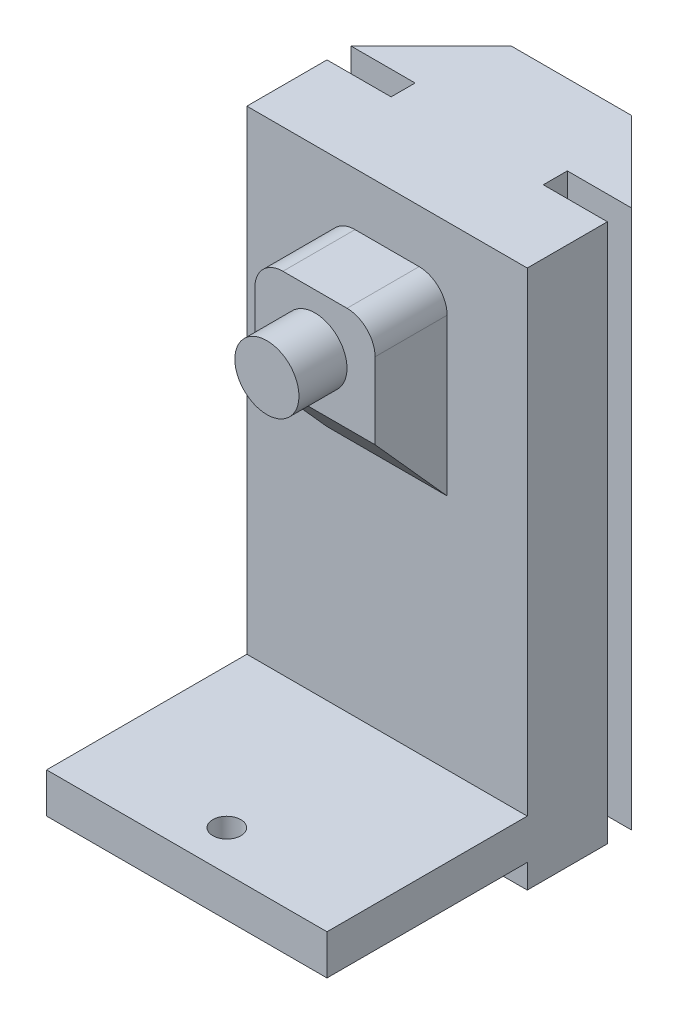
ISO-10303-21;
HEADER;
FILE_DESCRIPTION(('STEP AP214'),'2;1');
FILE_NAME('part.step','',(''),(''),'','','');
FILE_SCHEMA(('AUTOMOTIVE_DESIGN { 1 0 10303 214 1 1 1 1 }'));
ENDSEC;
DATA;
#1=APPLICATION_CONTEXT('core data for automotive mechanical design processes');
#2=APPLICATION_PROTOCOL_DEFINITION('international standard','automotive_design',2000,#1);
#3=PRODUCT_CONTEXT('',#1,'mechanical');
#4=PRODUCT('Part','Part','',(#3));
#5=PRODUCT_RELATED_PRODUCT_CATEGORY('part','',(#4));
#6=PRODUCT_DEFINITION_FORMATION('','',#4);
#7=PRODUCT_DEFINITION_CONTEXT('part definition',#1,'design');
#8=PRODUCT_DEFINITION('design','',#6,#7);
#9=PRODUCT_DEFINITION_SHAPE('','',#8);
#10=(LENGTH_UNIT() NAMED_UNIT(*) SI_UNIT(.MILLI.,.METRE.));
#11=(NAMED_UNIT(*) PLANE_ANGLE_UNIT() SI_UNIT($,.RADIAN.));
#12=(NAMED_UNIT(*) SI_UNIT($,.STERADIAN.) SOLID_ANGLE_UNIT());
#13=UNCERTAINTY_MEASURE_WITH_UNIT(LENGTH_MEASURE(1.E-05),#10,'distance_accuracy_value','');
#14=(GEOMETRIC_REPRESENTATION_CONTEXT(3) GLOBAL_UNCERTAINTY_ASSIGNED_CONTEXT((#13)) GLOBAL_UNIT_ASSIGNED_CONTEXT((#10,
#11,#12)) REPRESENTATION_CONTEXT('',''));
#15=CARTESIAN_POINT('',(0.,0.,0.));
#16=DIRECTION('',(0.,0.,1.));
#17=DIRECTION('',(1.,0.,0.));
#18=AXIS2_PLACEMENT_3D('',#15,#16,#17);
#19=CARTESIAN_POINT('',(-17.5,67.25,27.1211370506567));
#20=DIRECTION('',(0.,0.,-1.));
#21=DIRECTION('',(-1.,0.,0.));
#22=AXIS2_PLACEMENT_3D('',#19,#20,#21);
#23=PLANE('',#22);
#24=DIRECTION('',(0.,1.,0.));
#25=VECTOR('',#24,1.);
#26=CARTESIAN_POINT('',(7.5,47.65,27.1211370506567));
#27=LINE('',#26,#25);
#28=CARTESIAN_POINT('',(7.5,37.6100229741097,27.1211370506567));
#29=VERTEX_POINT('',#28);
#30=CARTESIAN_POINT('',(7.5,57.15,27.1211370506567));
#31=VERTEX_POINT('',#30);
#32=EDGE_CURVE('E267',#29,#31,#27,.T.);
#33=ORIENTED_EDGE('',*,*,#32,.F.);
#34=DIRECTION('',(-1.,0.,0.));
#35=VECTOR('',#34,1.);
#36=CARTESIAN_POINT('',(7.5,37.6100229741097,27.1211370506567));
#37=LINE('',#36,#35);
#38=CARTESIAN_POINT('',(-7.5,37.6100229741097,27.1211370506567));
#39=VERTEX_POINT('',#38);
#40=EDGE_CURVE('E236',#29,#39,#37,.T.);
#41=ORIENTED_EDGE('',*,*,#40,.T.);
#42=DIRECTION('',(0.,-1.,0.));
#43=VECTOR('',#42,1.);
#44=CARTESIAN_POINT('',(-7.5,47.65,27.1211370506567));
#45=LINE('',#44,#43);
#46=CARTESIAN_POINT('',(-7.5,57.15,27.1211370506567));
#47=VERTEX_POINT('',#46);
#48=EDGE_CURVE('E241',#47,#39,#45,.T.);
#49=ORIENTED_EDGE('',*,*,#48,.F.);
#50=CARTESIAN_POINT('',(-4.,57.15,27.1211370506567));
#51=DIRECTION('',(0.,0.,1.));
#52=DIRECTION('',(-1.,0.,0.));
#53=AXIS2_PLACEMENT_3D('',#50,#51,#52);
#54=CIRCLE('',#53,3.5);
#55=CARTESIAN_POINT('',(-4.,60.65,27.1211370506567));
#56=VERTEX_POINT('',#55);
#57=EDGE_CURVE('E250',#56,#47,#54,.T.);
#58=ORIENTED_EDGE('',*,*,#57,.F.);
#59=DIRECTION('',(-1.,0.,0.));
#60=VECTOR('',#59,1.);
#61=CARTESIAN_POINT('',(-4.,60.65,27.1211370506567));
#62=LINE('',#61,#60);
#63=CARTESIAN_POINT('',(4.,60.65,27.1211370506567));
#64=VERTEX_POINT('',#63);
#65=EDGE_CURVE('E272',#64,#56,#62,.T.);
#66=ORIENTED_EDGE('',*,*,#65,.F.);
#67=CARTESIAN_POINT('',(4.,57.15,27.1211370506567));
#68=DIRECTION('',(0.,0.,1.));
#69=DIRECTION('',(-1.,0.,0.));
#70=AXIS2_PLACEMENT_3D('',#67,#68,#69);
#71=CIRCLE('',#70,3.5);
#72=EDGE_CURVE('E68',#31,#64,#71,.T.);
#73=ORIENTED_EDGE('',*,*,#72,.F.);
#74=EDGE_LOOP('',(#33,#41,#49,#58,#66,#73));
#75=FACE_BOUND('',#74,.T.);
#76=DIRECTION('',(-1.,0.,0.));
#77=VECTOR('',#76,1.);
#78=CARTESIAN_POINT('',(17.5,8.,27.1211370506567));
#79=LINE('',#78,#77);
#80=CARTESIAN_POINT('',(17.5,8.,27.1211370506567));
#81=VERTEX_POINT('',#80);
#82=CARTESIAN_POINT('',(-17.5,8.,27.1211370506567));
#83=VERTEX_POINT('',#82);
#84=EDGE_CURVE('E486',#81,#83,#79,.T.);
#85=ORIENTED_EDGE('',*,*,#84,.F.);
#86=DIRECTION('',(0.,-1.,0.));
#87=VECTOR('',#86,1.);
#88=CARTESIAN_POINT('',(17.5,67.25,27.1211370506567));
#89=LINE('',#88,#87);
#90=CARTESIAN_POINT('',(17.5,67.25,27.1211370506567));
#91=VERTEX_POINT('',#90);
#92=EDGE_CURVE('E213',#91,#81,#89,.T.);
#93=ORIENTED_EDGE('',*,*,#92,.F.);
#94=DIRECTION('',(1.,0.,0.));
#95=VECTOR('',#94,1.);
#96=CARTESIAN_POINT('',(-17.5,67.25,27.1211370506567));
#97=LINE('',#96,#95);
#98=CARTESIAN_POINT('',(-17.5,67.25,27.1211370506567));
#99=VERTEX_POINT('',#98);
#100=EDGE_CURVE('E315',#99,#91,#97,.T.);
#101=ORIENTED_EDGE('',*,*,#100,.F.);
#102=DIRECTION('',(0.,-1.,0.));
#103=VECTOR('',#102,1.);
#104=CARTESIAN_POINT('',(-17.5,67.25,27.1211370506567));
#105=LINE('',#104,#103);
#106=EDGE_CURVE('E403',#99,#83,#105,.T.);
#107=ORIENTED_EDGE('',*,*,#106,.T.);
#108=EDGE_LOOP('',(#85,#93,#101,#107));
#109=FACE_BOUND('',#108,.T.);
#110=ADVANCED_FACE('F44',(#75,#109),#23,.F.);
#111=DIRECTION('',(-1.,0.,0.));
#112=VECTOR('',#111,1.);
#113=CARTESIAN_POINT('',(17.5,3.,27.1211370506567));
#114=LINE('',#113,#112);
#115=CARTESIAN_POINT('',(17.5,3.,27.1211370506567));
#116=VERTEX_POINT('',#115);
#117=CARTESIAN_POINT('',(-17.5,3.,27.1211370506567));
#118=VERTEX_POINT('',#117);
#119=EDGE_CURVE('E65',#116,#118,#114,.T.);
#120=ORIENTED_EDGE('',*,*,#119,.T.);
#121=CARTESIAN_POINT('',(-17.5,0.,27.1211370506567));
#122=VERTEX_POINT('',#121);
#123=EDGE_CURVE('E404',#118,#122,#105,.T.);
#124=ORIENTED_EDGE('',*,*,#123,.T.);
#125=DIRECTION('',(1.,0.,0.));
#126=VECTOR('',#125,1.);
#127=CARTESIAN_POINT('',(-17.5,0.,27.1211370506567));
#128=LINE('',#127,#126);
#129=CARTESIAN_POINT('',(17.5,0.,27.1211370506567));
#130=VERTEX_POINT('',#129);
#131=EDGE_CURVE('E348',#122,#130,#128,.T.);
#132=ORIENTED_EDGE('',*,*,#131,.T.);
#133=EDGE_CURVE('E402',#116,#130,#89,.T.);
#134=ORIENTED_EDGE('',*,*,#133,.F.);
#135=EDGE_LOOP('',(#120,#124,#132,#134));
#136=FACE_BOUND('',#135,.T.);
#137=ADVANCED_FACE('F479',(#136),#23,.F.);
#138=CARTESIAN_POINT('',(-17.5,67.25,14.1211370506567));
#139=DIRECTION('',(0.,0.,-1.));
#140=DIRECTION('',(-1.,0.,0.));
#141=AXIS2_PLACEMENT_3D('',#138,#139,#140);
#142=PLANE('',#141);
#143=DIRECTION('',(1.,0.,0.));
#144=VECTOR('',#143,1.);
#145=CARTESIAN_POINT('',(-17.5,0.,14.1211370506567));
#146=LINE('',#145,#144);
#147=CARTESIAN_POINT('',(-17.5,0.,14.1211370506567));
#148=VERTEX_POINT('',#147);
#149=CARTESIAN_POINT('',(-9.5,0.,14.1211370506567));
#150=VERTEX_POINT('',#149);
#151=EDGE_CURVE('E300',#148,#150,#146,.T.);
#152=ORIENTED_EDGE('',*,*,#151,.T.);
#153=DIRECTION('',(0.,-1.,0.));
#154=VECTOR('',#153,1.);
#155=CARTESIAN_POINT('',(-9.5,67.25,14.1211370506567));
#156=LINE('',#155,#154);
#157=CARTESIAN_POINT('',(-9.5,67.25,14.1211370506567));
#158=VERTEX_POINT('',#157);
#159=EDGE_CURVE('E54',#158,#150,#156,.T.);
#160=ORIENTED_EDGE('',*,*,#159,.F.);
#161=DIRECTION('',(1.,0.,0.));
#162=VECTOR('',#161,1.);
#163=CARTESIAN_POINT('',(-17.5,67.25,14.1211370506567));
#164=LINE('',#163,#162);
#165=CARTESIAN_POINT('',(-17.5,67.25,14.1211370506567));
#166=VERTEX_POINT('',#165);
#167=EDGE_CURVE('E296',#166,#158,#164,.T.);
#168=ORIENTED_EDGE('',*,*,#167,.F.);
#169=DIRECTION('',(0.,-1.,0.));
#170=VECTOR('',#169,1.);
#171=CARTESIAN_POINT('',(-17.5,67.25,14.1211370506567));
#172=LINE('',#171,#170);
#173=EDGE_CURVE('E337',#166,#148,#172,.T.);
#174=ORIENTED_EDGE('',*,*,#173,.T.);
#175=EDGE_LOOP('',(#152,#160,#168,#174));
#176=FACE_BOUND('',#175,.T.);
#177=ADVANCED_FACE('F50',(#176),#142,.F.);
#178=CARTESIAN_POINT('',(-9.5,67.25,17.1211370506567));
#179=DIRECTION('',(1.,0.,0.));
#180=DIRECTION('',(0.,0.,-1.));
#181=AXIS2_PLACEMENT_3D('',#178,#179,#180);
#182=PLANE('',#181);
#183=DIRECTION('',(0.,0.,1.));
#184=VECTOR('',#183,1.);
#185=CARTESIAN_POINT('',(-9.5,0.,17.1211370506567));
#186=LINE('',#185,#184);
#187=CARTESIAN_POINT('',(-9.5,0.,17.1211370506567));
#188=VERTEX_POINT('',#187);
#189=EDGE_CURVE('E338',#150,#188,#186,.T.);
#190=ORIENTED_EDGE('',*,*,#189,.T.);
#191=DIRECTION('',(0.,-1.,0.));
#192=VECTOR('',#191,1.);
#193=CARTESIAN_POINT('',(-9.5,67.25,17.1211370506567));
#194=LINE('',#193,#192);
#195=CARTESIAN_POINT('',(-9.5,67.25,17.1211370506567));
#196=VERTEX_POINT('',#195);
#197=EDGE_CURVE('E414',#196,#188,#194,.T.);
#198=ORIENTED_EDGE('',*,*,#197,.F.);
#199=DIRECTION('',(0.,0.,1.));
#200=VECTOR('',#199,1.);
#201=CARTESIAN_POINT('',(-9.5,67.25,17.1211370506567));
#202=LINE('',#201,#200);
#203=EDGE_CURVE('E305',#158,#196,#202,.T.);
#204=ORIENTED_EDGE('',*,*,#203,.F.);
#205=ORIENTED_EDGE('',*,*,#159,.T.);
#206=EDGE_LOOP('',(#190,#198,#204,#205));
#207=FACE_BOUND('',#206,.T.);
#208=ADVANCED_FACE('F423',(#207),#182,.F.);
#209=CARTESIAN_POINT('',(-17.5,67.25,17.1211370506567));
#210=DIRECTION('',(0.,0.,1.));
#211=DIRECTION('',(1.,0.,0.));
#212=AXIS2_PLACEMENT_3D('',#209,#210,#211);
#213=PLANE('',#212);
#214=DIRECTION('',(-1.,0.,0.));
#215=VECTOR('',#214,1.);
#216=CARTESIAN_POINT('',(-17.5,0.,17.1211370506567));
#217=LINE('',#216,#215);
#218=CARTESIAN_POINT('',(-17.5,0.,17.1211370506567));
#219=VERTEX_POINT('',#218);
#220=EDGE_CURVE('E342',#188,#219,#217,.T.);
#221=ORIENTED_EDGE('',*,*,#220,.T.);
#222=DIRECTION('',(0.,-1.,0.));
#223=VECTOR('',#222,1.);
#224=CARTESIAN_POINT('',(-17.5,67.25,17.1211370506567));
#225=LINE('',#224,#223);
#226=CARTESIAN_POINT('',(-17.5,67.25,17.1211370506567));
#227=VERTEX_POINT('',#226);
#228=EDGE_CURVE('E408',#227,#219,#225,.T.);
#229=ORIENTED_EDGE('',*,*,#228,.F.);
#230=DIRECTION('',(-1.,0.,0.));
#231=VECTOR('',#230,1.);
#232=CARTESIAN_POINT('',(-17.5,67.25,17.1211370506567));
#233=LINE('',#232,#231);
#234=EDGE_CURVE('E306',#196,#227,#233,.T.);
#235=ORIENTED_EDGE('',*,*,#234,.F.);
#236=ORIENTED_EDGE('',*,*,#197,.T.);
#237=EDGE_LOOP('',(#221,#229,#235,#236));
#238=FACE_BOUND('',#237,.T.);
#239=ADVANCED_FACE('F436',(#238),#213,.F.);
#240=CARTESIAN_POINT('',(-17.5,67.25,27.1211370506567));
#241=DIRECTION('',(1.,0.,0.));
#242=DIRECTION('',(0.,0.,-1.));
#243=AXIS2_PLACEMENT_3D('',#240,#241,#242);
#244=PLANE('',#243);
#245=DIRECTION('',(0.,0.,1.));
#246=VECTOR('',#245,1.);
#247=CARTESIAN_POINT('',(-17.5,0.,27.1211370506567));
#248=LINE('',#247,#246);
#249=EDGE_CURVE('E347',#219,#122,#248,.T.);
#250=ORIENTED_EDGE('',*,*,#249,.T.);
#251=ORIENTED_EDGE('',*,*,#123,.F.);
#252=DIRECTION('',(0.,0.,-1.));
#253=VECTOR('',#252,1.);
#254=CARTESIAN_POINT('',(-17.5,3.,27.1211370506567));
#255=LINE('',#254,#253);
#256=CARTESIAN_POINT('',(-17.5,3.,52.1211370506567));
#257=VERTEX_POINT('',#256);
#258=EDGE_CURVE('E219',#257,#118,#255,.T.);
#259=ORIENTED_EDGE('',*,*,#258,.F.);
#260=DIRECTION('',(0.,-1.,0.));
#261=VECTOR('',#260,1.);
#262=CARTESIAN_POINT('',(-17.5,3.,52.1211370506567));
#263=LINE('',#262,#261);
#264=CARTESIAN_POINT('',(-17.5,8.,52.1211370506567));
#265=VERTEX_POINT('',#264);
#266=EDGE_CURVE('E482',#265,#257,#263,.T.);
#267=ORIENTED_EDGE('',*,*,#266,.F.);
#268=DIRECTION('',(0.,0.,1.));
#269=VECTOR('',#268,1.);
#270=CARTESIAN_POINT('',(-17.5,8.,52.1211370506567));
#271=LINE('',#270,#269);
#272=EDGE_CURVE('E225',#83,#265,#271,.T.);
#273=ORIENTED_EDGE('',*,*,#272,.F.);
#274=ORIENTED_EDGE('',*,*,#106,.F.);
#275=DIRECTION('',(0.,0.,1.));
#276=VECTOR('',#275,1.);
#277=CARTESIAN_POINT('',(-17.5,67.25,27.1211370506567));
#278=LINE('',#277,#276);
#279=EDGE_CURVE('E307',#227,#99,#278,.T.);
#280=ORIENTED_EDGE('',*,*,#279,.F.);
#281=ORIENTED_EDGE('',*,*,#228,.T.);
#282=EDGE_LOOP('',(#250,#251,#259,#267,#273,#274,#280,#281));
#283=FACE_BOUND('',#282,.T.);
#284=ADVANCED_FACE('F439',(#283),#244,.F.);
#285=CARTESIAN_POINT('',(17.5,67.25,27.1211370506567));
#286=DIRECTION('',(-1.,0.,0.));
#287=DIRECTION('',(0.,0.,1.));
#288=AXIS2_PLACEMENT_3D('',#285,#286,#287);
#289=PLANE('',#288);
#290=DIRECTION('',(0.,0.,-1.));
#291=VECTOR('',#290,1.);
#292=CARTESIAN_POINT('',(17.5,0.,27.1211370506567));
#293=LINE('',#292,#291);
#294=CARTESIAN_POINT('',(17.5,0.,17.1211370506567));
#295=VERTEX_POINT('',#294);
#296=EDGE_CURVE('E351',#130,#295,#293,.T.);
#297=ORIENTED_EDGE('',*,*,#296,.T.);
#298=DIRECTION('',(0.,-1.,0.));
#299=VECTOR('',#298,1.);
#300=CARTESIAN_POINT('',(17.5,67.25,17.1211370506567));
#301=LINE('',#300,#299);
#302=CARTESIAN_POINT('',(17.5,67.25,17.1211370506567));
#303=VERTEX_POINT('',#302);
#304=EDGE_CURVE('E400',#303,#295,#301,.T.);
#305=ORIENTED_EDGE('',*,*,#304,.F.);
#306=DIRECTION('',(0.,0.,-1.));
#307=VECTOR('',#306,1.);
#308=CARTESIAN_POINT('',(17.5,67.25,27.1211370506567));
#309=LINE('',#308,#307);
#310=EDGE_CURVE('E314',#91,#303,#309,.T.);
#311=ORIENTED_EDGE('',*,*,#310,.F.);
#312=ORIENTED_EDGE('',*,*,#92,.T.);
#313=DIRECTION('',(0.,0.,1.));
#314=VECTOR('',#313,1.);
#315=CARTESIAN_POINT('',(17.5,8.,52.1211370506567));
#316=LINE('',#315,#314);
#317=CARTESIAN_POINT('',(17.5,8.,52.1211370506567));
#318=VERTEX_POINT('',#317);
#319=EDGE_CURVE('E206',#81,#318,#316,.T.);
#320=ORIENTED_EDGE('',*,*,#319,.T.);
#321=DIRECTION('',(0.,-1.,0.));
#322=VECTOR('',#321,1.);
#323=CARTESIAN_POINT('',(17.5,3.,52.1211370506567));
#324=LINE('',#323,#322);
#325=CARTESIAN_POINT('',(17.5,3.,52.1211370506567));
#326=VERTEX_POINT('',#325);
#327=EDGE_CURVE('E200',#318,#326,#324,.T.);
#328=ORIENTED_EDGE('',*,*,#327,.T.);
#329=DIRECTION('',(0.,0.,-1.));
#330=VECTOR('',#329,1.);
#331=CARTESIAN_POINT('',(17.5,3.,27.1211370506567));
#332=LINE('',#331,#330);
#333=EDGE_CURVE('E210',#326,#116,#332,.T.);
#334=ORIENTED_EDGE('',*,*,#333,.T.);
#335=ORIENTED_EDGE('',*,*,#133,.T.);
#336=EDGE_LOOP('',(#297,#305,#311,#312,#320,#328,#334,#335));
#337=FACE_BOUND('',#336,.T.);
#338=ADVANCED_FACE('F211',(#337),#289,.F.);
#339=CARTESIAN_POINT('',(17.5,67.25,17.1211370506567));
#340=DIRECTION('',(0.,0.,1.));
#341=DIRECTION('',(1.,0.,0.));
#342=AXIS2_PLACEMENT_3D('',#339,#340,#341);
#343=PLANE('',#342);
#344=DIRECTION('',(-1.,0.,0.));
#345=VECTOR('',#344,1.);
#346=CARTESIAN_POINT('',(17.5,0.,17.1211370506567));
#347=LINE('',#346,#345);
#348=CARTESIAN_POINT('',(9.5,0.,17.1211370506567));
#349=VERTEX_POINT('',#348);
#350=EDGE_CURVE('E357',#295,#349,#347,.T.);
#351=ORIENTED_EDGE('',*,*,#350,.T.);
#352=DIRECTION('',(0.,-1.,0.));
#353=VECTOR('',#352,1.);
#354=CARTESIAN_POINT('',(9.5,67.25,17.1211370506567));
#355=LINE('',#354,#353);
#356=CARTESIAN_POINT('',(9.5,67.25,17.1211370506567));
#357=VERTEX_POINT('',#356);
#358=EDGE_CURVE('E394',#357,#349,#355,.T.);
#359=ORIENTED_EDGE('',*,*,#358,.F.);
#360=DIRECTION('',(-1.,0.,0.));
#361=VECTOR('',#360,1.);
#362=CARTESIAN_POINT('',(17.5,67.25,17.1211370506567));
#363=LINE('',#362,#361);
#364=EDGE_CURVE('E319',#303,#357,#363,.T.);
#365=ORIENTED_EDGE('',*,*,#364,.F.);
#366=ORIENTED_EDGE('',*,*,#304,.T.);
#367=EDGE_LOOP('',(#351,#359,#365,#366));
#368=FACE_BOUND('',#367,.T.);
#369=ADVANCED_FACE('F475',(#368),#343,.F.);
#370=CARTESIAN_POINT('',(9.5,67.25,17.1211370506567));
#371=DIRECTION('',(-1.,0.,0.));
#372=DIRECTION('',(0.,0.,1.));
#373=AXIS2_PLACEMENT_3D('',#370,#371,#372);
#374=PLANE('',#373);
#375=DIRECTION('',(0.,0.,-1.));
#376=VECTOR('',#375,1.);
#377=CARTESIAN_POINT('',(9.5,0.,17.1211370506567));
#378=LINE('',#377,#376);
#379=CARTESIAN_POINT('',(9.5,0.,14.1211370506567));
#380=VERTEX_POINT('',#379);
#381=EDGE_CURVE('E359',#349,#380,#378,.T.);
#382=ORIENTED_EDGE('',*,*,#381,.T.);
#383=DIRECTION('',(0.,-1.,0.));
#384=VECTOR('',#383,1.);
#385=CARTESIAN_POINT('',(9.5,67.25,14.1211370506567));
#386=LINE('',#385,#384);
#387=CARTESIAN_POINT('',(9.5,67.25,14.1211370506567));
#388=VERTEX_POINT('',#387);
#389=EDGE_CURVE('E388',#388,#380,#386,.T.);
#390=ORIENTED_EDGE('',*,*,#389,.F.);
#391=DIRECTION('',(0.,0.,-1.));
#392=VECTOR('',#391,1.);
#393=CARTESIAN_POINT('',(9.5,67.25,17.1211370506567));
#394=LINE('',#393,#392);
#395=EDGE_CURVE('E321',#357,#388,#394,.T.);
#396=ORIENTED_EDGE('',*,*,#395,.F.);
#397=ORIENTED_EDGE('',*,*,#358,.T.);
#398=EDGE_LOOP('',(#382,#390,#396,#397));
#399=FACE_BOUND('',#398,.T.);
#400=ADVANCED_FACE('F470',(#399),#374,.F.);
#401=CARTESIAN_POINT('',(17.5,67.25,14.1211370506567));
#402=DIRECTION('',(0.,0.,-1.));
#403=DIRECTION('',(-1.,0.,0.));
#404=AXIS2_PLACEMENT_3D('',#401,#402,#403);
#405=PLANE('',#404);
#406=DIRECTION('',(1.,0.,0.));
#407=VECTOR('',#406,1.);
#408=CARTESIAN_POINT('',(17.5,0.,14.1211370506567));
#409=LINE('',#408,#407);
#410=CARTESIAN_POINT('',(17.5,0.,14.1211370506567));
#411=VERTEX_POINT('',#410);
#412=EDGE_CURVE('E361',#380,#411,#409,.T.);
#413=ORIENTED_EDGE('',*,*,#412,.T.);
#414=DIRECTION('',(0.,-1.,0.));
#415=VECTOR('',#414,1.);
#416=CARTESIAN_POINT('',(17.5,67.25,14.1211370506567));
#417=LINE('',#416,#415);
#418=CARTESIAN_POINT('',(17.5,67.25,14.1211370506567));
#419=VERTEX_POINT('',#418);
#420=EDGE_CURVE('E383',#419,#411,#417,.T.);
#421=ORIENTED_EDGE('',*,*,#420,.F.);
#422=DIRECTION('',(1.,0.,0.));
#423=VECTOR('',#422,1.);
#424=CARTESIAN_POINT('',(17.5,67.25,14.1211370506567));
#425=LINE('',#424,#423);
#426=EDGE_CURVE('E323',#388,#419,#425,.T.);
#427=ORIENTED_EDGE('',*,*,#426,.F.);
#428=ORIENTED_EDGE('',*,*,#389,.T.);
#429=EDGE_LOOP('',(#413,#421,#427,#428));
#430=FACE_BOUND('',#429,.T.);
#431=ADVANCED_FACE('F464',(#430),#405,.F.);
#432=CARTESIAN_POINT('',(17.5,67.25,14.1211370506567));
#433=DIRECTION('',(-0.707106781186549,0.,0.707106781186546));
#434=DIRECTION('',(0.707106781186546,0.,0.707106781186549));
#435=AXIS2_PLACEMENT_3D('',#432,#433,#434);
#436=PLANE('',#435);
#437=DIRECTION('',(-0.707106781186546,0.,-0.707106781186549));
#438=VECTOR('',#437,1.);
#439=CARTESIAN_POINT('',(17.5,0.,14.1211370506567));
#440=LINE('',#439,#438);
#441=CARTESIAN_POINT('',(7.50000000000004,0.,4.12113705065668));
#442=VERTEX_POINT('',#441);
#443=EDGE_CURVE('E366',#411,#442,#440,.T.);
#444=ORIENTED_EDGE('',*,*,#443,.T.);
#445=DIRECTION('',(0.,-1.,0.));
#446=VECTOR('',#445,1.);
#447=CARTESIAN_POINT('',(7.50000000000004,67.25,4.12113705065668));
#448=LINE('',#447,#446);
#449=CARTESIAN_POINT('',(7.50000000000004,67.25,4.12113705065668));
#450=VERTEX_POINT('',#449);
#451=EDGE_CURVE('E382',#450,#442,#448,.T.);
#452=ORIENTED_EDGE('',*,*,#451,.F.);
#453=DIRECTION('',(-0.707106781186546,0.,-0.707106781186549));
#454=VECTOR('',#453,1.);
#455=CARTESIAN_POINT('',(17.5,67.25,14.1211370506567));
#456=LINE('',#455,#454);
#457=EDGE_CURVE('E330',#419,#450,#456,.T.);
#458=ORIENTED_EDGE('',*,*,#457,.F.);
#459=ORIENTED_EDGE('',*,*,#420,.T.);
#460=EDGE_LOOP('',(#444,#452,#458,#459));
#461=FACE_BOUND('',#460,.T.);
#462=ADVANCED_FACE('F459',(#461),#436,.F.);
#463=CARTESIAN_POINT('',(-7.50000000000004,67.25,4.12113705065667));
#464=DIRECTION('',(0.,0.,1.));
#465=DIRECTION('',(1.,0.,0.));
#466=AXIS2_PLACEMENT_3D('',#463,#464,#465);
#467=PLANE('',#466);
#468=DIRECTION('',(-1.,0.,0.));
#469=VECTOR('',#468,1.);
#470=CARTESIAN_POINT('',(-7.50000000000004,0.,4.12113705065667));
#471=LINE('',#470,#469);
#472=CARTESIAN_POINT('',(-7.50000000000004,0.,4.12113705065667));
#473=VERTEX_POINT('',#472);
#474=EDGE_CURVE('E367',#442,#473,#471,.T.);
#475=ORIENTED_EDGE('',*,*,#474,.T.);
#476=DIRECTION('',(0.,-1.,0.));
#477=VECTOR('',#476,1.);
#478=CARTESIAN_POINT('',(-7.50000000000004,67.25,4.12113705065667));
#479=LINE('',#478,#477);
#480=CARTESIAN_POINT('',(-7.50000000000004,67.25,4.12113705065667));
#481=VERTEX_POINT('',#480);
#482=EDGE_CURVE('E380',#481,#473,#479,.T.);
#483=ORIENTED_EDGE('',*,*,#482,.F.);
#484=DIRECTION('',(-1.,0.,0.));
#485=VECTOR('',#484,1.);
#486=CARTESIAN_POINT('',(-7.50000000000004,67.25,4.12113705065667));
#487=LINE('',#486,#485);
#488=EDGE_CURVE('E328',#450,#481,#487,.T.);
#489=ORIENTED_EDGE('',*,*,#488,.F.);
#490=ORIENTED_EDGE('',*,*,#451,.T.);
#491=EDGE_LOOP('',(#475,#483,#489,#490));
#492=FACE_BOUND('',#491,.T.);
#493=ADVANCED_FACE('F455',(#492),#467,.F.);
#494=CARTESIAN_POINT('',(-17.5,67.25,14.1211370506567));
#495=DIRECTION('',(0.707106781186549,0.,0.707106781186546));
#496=DIRECTION('',(0.707106781186546,0.,-0.707106781186549));
#497=AXIS2_PLACEMENT_3D('',#494,#495,#496);
#498=PLANE('',#497);
#499=DIRECTION('',(-0.707106781186546,0.,0.707106781186549));
#500=VECTOR('',#499,1.);
#501=CARTESIAN_POINT('',(-17.5,0.,14.1211370506567));
#502=LINE('',#501,#500);
#503=EDGE_CURVE('E303',#473,#148,#502,.T.);
#504=ORIENTED_EDGE('',*,*,#503,.T.);
#505=ORIENTED_EDGE('',*,*,#173,.F.);
#506=DIRECTION('',(-0.707106781186546,0.,0.707106781186549));
#507=VECTOR('',#506,1.);
#508=CARTESIAN_POINT('',(-17.5,67.25,14.1211370506567));
#509=LINE('',#508,#507);
#510=EDGE_CURVE('E334',#481,#166,#509,.T.);
#511=ORIENTED_EDGE('',*,*,#510,.F.);
#512=ORIENTED_EDGE('',*,*,#482,.T.);
#513=EDGE_LOOP('',(#504,#505,#511,#512));
#514=FACE_BOUND('',#513,.T.);
#515=ADVANCED_FACE('F448',(#514),#498,.F.);
#516=CARTESIAN_POINT('',(0.,67.25,0.));
#517=DIRECTION('',(0.,1.,0.));
#518=DIRECTION('',(0.,0.,1.));
#519=AXIS2_PLACEMENT_3D('',#516,#517,#518);
#520=PLANE('',#519);
#521=ORIENTED_EDGE('',*,*,#167,.T.);
#522=ORIENTED_EDGE('',*,*,#203,.T.);
#523=ORIENTED_EDGE('',*,*,#234,.T.);
#524=ORIENTED_EDGE('',*,*,#279,.T.);
#525=ORIENTED_EDGE('',*,*,#100,.T.);
#526=ORIENTED_EDGE('',*,*,#310,.T.);
#527=ORIENTED_EDGE('',*,*,#364,.T.);
#528=ORIENTED_EDGE('',*,*,#395,.T.);
#529=ORIENTED_EDGE('',*,*,#426,.T.);
#530=ORIENTED_EDGE('',*,*,#457,.T.);
#531=ORIENTED_EDGE('',*,*,#488,.T.);
#532=ORIENTED_EDGE('',*,*,#510,.T.);
#533=EDGE_LOOP('',(#521,#522,#523,#524,#525,#526,#527,#528,#529,#530,#531,#532));
#534=FACE_BOUND('',#533,.T.);
#535=ADVANCED_FACE('F444',(#534),#520,.T.);
#536=CARTESIAN_POINT('',(0.,0.,0.));
#537=DIRECTION('',(0.,1.,0.));
#538=DIRECTION('',(0.,0.,1.));
#539=AXIS2_PLACEMENT_3D('',#536,#537,#538);
#540=PLANE('',#539);
#541=ORIENTED_EDGE('',*,*,#151,.F.);
#542=ORIENTED_EDGE('',*,*,#503,.F.);
#543=ORIENTED_EDGE('',*,*,#474,.F.);
#544=ORIENTED_EDGE('',*,*,#443,.F.);
#545=ORIENTED_EDGE('',*,*,#412,.F.);
#546=ORIENTED_EDGE('',*,*,#381,.F.);
#547=ORIENTED_EDGE('',*,*,#350,.F.);
#548=ORIENTED_EDGE('',*,*,#296,.F.);
#549=ORIENTED_EDGE('',*,*,#131,.F.);
#550=ORIENTED_EDGE('',*,*,#249,.F.);
#551=ORIENTED_EDGE('',*,*,#220,.F.);
#552=ORIENTED_EDGE('',*,*,#189,.F.);
#553=EDGE_LOOP('',(#541,#542,#543,#544,#545,#546,#547,#548,#549,#550,#551,#552));
#554=FACE_BOUND('',#553,.T.);
#555=ADVANCED_FACE('F429',(#554),#540,.F.);
#556=CARTESIAN_POINT('',(-4.,57.15,36.1211370506567));
#557=DIRECTION('',(0.,0.,-1.));
#558=DIRECTION('',(-1.,0.,0.));
#559=AXIS2_PLACEMENT_3D('',#556,#557,#558);
#560=PLANE('',#559);
#561=DIRECTION('',(0.,-1.,0.));
#562=VECTOR('',#561,1.);
#563=CARTESIAN_POINT('',(-7.5,47.65,36.1211370506567));
#564=LINE('',#563,#562);
#565=CARTESIAN_POINT('',(-7.5,57.15,36.1211370506567));
#566=VERTEX_POINT('',#565);
#567=CARTESIAN_POINT('',(-7.5,47.65,36.1211370506567));
#568=VERTEX_POINT('',#567);
#569=EDGE_CURVE('E245',#566,#568,#564,.T.);
#570=ORIENTED_EDGE('',*,*,#569,.T.);
#571=DIRECTION('',(1.,0.,0.));
#572=VECTOR('',#571,1.);
#573=CARTESIAN_POINT('',(-7.5,47.65,36.1211370506567));
#574=LINE('',#573,#572);
#575=CARTESIAN_POINT('',(7.5,47.65,36.1211370506567));
#576=VERTEX_POINT('',#575);
#577=EDGE_CURVE('E246',#568,#576,#574,.T.);
#578=ORIENTED_EDGE('',*,*,#577,.T.);
#579=DIRECTION('',(0.,1.,0.));
#580=VECTOR('',#579,1.);
#581=CARTESIAN_POINT('',(7.5,47.65,36.1211370506567));
#582=LINE('',#581,#580);
#583=CARTESIAN_POINT('',(7.5,57.15,36.1211370506567));
#584=VERTEX_POINT('',#583);
#585=EDGE_CURVE('E252',#576,#584,#582,.T.);
#586=ORIENTED_EDGE('',*,*,#585,.T.);
#587=CARTESIAN_POINT('',(4.,57.15,36.1211370506567));
#588=DIRECTION('',(0.,0.,1.));
#589=DIRECTION('',(-1.,0.,0.));
#590=AXIS2_PLACEMENT_3D('',#587,#588,#589);
#591=CIRCLE('',#590,3.5);
#592=CARTESIAN_POINT('',(4.,60.65,36.1211370506567));
#593=VERTEX_POINT('',#592);
#594=EDGE_CURVE('E251',#584,#593,#591,.T.);
#595=ORIENTED_EDGE('',*,*,#594,.T.);
#596=DIRECTION('',(-1.,0.,0.));
#597=VECTOR('',#596,1.);
#598=CARTESIAN_POINT('',(-4.,60.65,36.1211370506567));
#599=LINE('',#598,#597);
#600=CARTESIAN_POINT('',(-4.,60.65,36.1211370506567));
#601=VERTEX_POINT('',#600);
#602=EDGE_CURVE('E260',#593,#601,#599,.T.);
#603=ORIENTED_EDGE('',*,*,#602,.T.);
#604=CARTESIAN_POINT('',(-4.,57.15,36.1211370506567));
#605=DIRECTION('',(0.,0.,1.));
#606=DIRECTION('',(-1.,0.,0.));
#607=AXIS2_PLACEMENT_3D('',#604,#605,#606);
#608=CIRCLE('',#607,3.5);
#609=EDGE_CURVE('E259',#601,#566,#608,.T.);
#610=ORIENTED_EDGE('',*,*,#609,.T.);
#611=EDGE_LOOP('',(#570,#578,#586,#595,#603,#610));
#612=FACE_BOUND('',#611,.T.);
#613=CARTESIAN_POINT('',(0.,54.15,36.1211370506567));
#614=DIRECTION('',(0.,0.,-1.));
#615=DIRECTION('',(-1.,0.,0.));
#616=AXIS2_PLACEMENT_3D('',#613,#614,#615);
#617=CIRCLE('',#616,4.);
#618=CARTESIAN_POINT('',(-4.,54.15,36.1211370506567));
#619=VERTEX_POINT('',#618);
#620=EDGE_CURVE('E11',#619,#619,#617,.T.);
#621=ORIENTED_EDGE('',*,*,#620,.T.);
#622=EDGE_LOOP('',(#621));
#623=FACE_BOUND('',#622,.T.);
#624=ADVANCED_FACE('F626',(#612,#623),#560,.F.);
#625=CARTESIAN_POINT('',(-7.5,47.65,36.1211370506567));
#626=DIRECTION('',(1.,0.,0.));
#627=DIRECTION('',(0.,1.,0.));
#628=AXIS2_PLACEMENT_3D('',#625,#626,#627);
#629=PLANE('',#628);
#630=ORIENTED_EDGE('',*,*,#48,.T.);
#631=DIRECTION('',(0.,-0.744619524412858,-0.667489148872976));
#632=VECTOR('',#631,1.);
#633=CARTESIAN_POINT('',(-7.5,47.65,36.1211370506567));
#634=LINE('',#633,#632);
#635=EDGE_CURVE('E221',#568,#39,#634,.T.);
#636=ORIENTED_EDGE('',*,*,#635,.F.);
#637=ORIENTED_EDGE('',*,*,#569,.F.);
#638=DIRECTION('',(0.,0.,-1.));
#639=VECTOR('',#638,1.);
#640=CARTESIAN_POINT('',(-7.5,57.15,36.1211370506567));
#641=LINE('',#640,#639);
#642=EDGE_CURVE('E264',#566,#47,#641,.T.);
#643=ORIENTED_EDGE('',*,*,#642,.T.);
#644=EDGE_LOOP('',(#630,#636,#637,#643));
#645=FACE_BOUND('',#644,.T.);
#646=ADVANCED_FACE('F670',(#645),#629,.F.);
#647=CARTESIAN_POINT('',(7.5,47.65,36.1211370506567));
#648=DIRECTION('',(-1.,0.,0.));
#649=DIRECTION('',(0.,-1.,0.));
#650=AXIS2_PLACEMENT_3D('',#647,#648,#649);
#651=PLANE('',#650);
#652=ORIENTED_EDGE('',*,*,#32,.T.);
#653=DIRECTION('',(0.,0.,-1.));
#654=VECTOR('',#653,1.);
#655=CARTESIAN_POINT('',(7.5,57.15,36.1211370506567));
#656=LINE('',#655,#654);
#657=EDGE_CURVE('E286',#584,#31,#656,.T.);
#658=ORIENTED_EDGE('',*,*,#657,.F.);
#659=ORIENTED_EDGE('',*,*,#585,.F.);
#660=DIRECTION('',(0.,-0.744619524412858,-0.667489148872976));
#661=VECTOR('',#660,1.);
#662=CARTESIAN_POINT('',(7.5,47.65,36.1211370506567));
#663=LINE('',#662,#661);
#664=EDGE_CURVE('E230',#576,#29,#663,.T.);
#665=ORIENTED_EDGE('',*,*,#664,.T.);
#666=EDGE_LOOP('',(#652,#658,#659,#665));
#667=FACE_BOUND('',#666,.T.);
#668=ADVANCED_FACE('F658',(#667),#651,.F.);
#669=CARTESIAN_POINT('',(4.,57.15,36.1211370506567));
#670=DIRECTION('',(0.,0.,-1.));
#671=DIRECTION('',(-1.,0.,0.));
#672=AXIS2_PLACEMENT_3D('',#669,#670,#671);
#673=CYLINDRICAL_SURFACE('',#672,3.5);
#674=ORIENTED_EDGE('',*,*,#72,.T.);
#675=DIRECTION('',(0.,0.,-1.));
#676=VECTOR('',#675,1.);
#677=CARTESIAN_POINT('',(4.,60.65,36.1211370506567));
#678=LINE('',#677,#676);
#679=EDGE_CURVE('E283',#593,#64,#678,.T.);
#680=ORIENTED_EDGE('',*,*,#679,.F.);
#681=ORIENTED_EDGE('',*,*,#594,.F.);
#682=ORIENTED_EDGE('',*,*,#657,.T.);
#683=EDGE_LOOP('',(#674,#680,#681,#682));
#684=FACE_BOUND('',#683,.T.);
#685=ADVANCED_FACE('F666',(#684),#673,.T.);
#686=CARTESIAN_POINT('',(-4.,60.65,36.1211370506567));
#687=DIRECTION('',(0.,-1.,0.));
#688=DIRECTION('',(0.,0.,-1.));
#689=AXIS2_PLACEMENT_3D('',#686,#687,#688);
#690=PLANE('',#689);
#691=ORIENTED_EDGE('',*,*,#65,.T.);
#692=DIRECTION('',(0.,0.,-1.));
#693=VECTOR('',#692,1.);
#694=CARTESIAN_POINT('',(-4.,60.65,36.1211370506567));
#695=LINE('',#694,#693);
#696=EDGE_CURVE('E282',#601,#56,#695,.T.);
#697=ORIENTED_EDGE('',*,*,#696,.F.);
#698=ORIENTED_EDGE('',*,*,#602,.F.);
#699=ORIENTED_EDGE('',*,*,#679,.T.);
#700=EDGE_LOOP('',(#691,#697,#698,#699));
#701=FACE_BOUND('',#700,.T.);
#702=ADVANCED_FACE('F698',(#701),#690,.F.);
#703=CARTESIAN_POINT('',(-4.,57.15,36.1211370506567));
#704=DIRECTION('',(0.,0.,-1.));
#705=DIRECTION('',(-1.,0.,0.));
#706=AXIS2_PLACEMENT_3D('',#703,#704,#705);
#707=CYLINDRICAL_SURFACE('',#706,3.5);
#708=ORIENTED_EDGE('',*,*,#57,.T.);
#709=ORIENTED_EDGE('',*,*,#642,.F.);
#710=ORIENTED_EDGE('',*,*,#609,.F.);
#711=ORIENTED_EDGE('',*,*,#696,.T.);
#712=EDGE_LOOP('',(#708,#709,#710,#711));
#713=FACE_BOUND('',#712,.T.);
#714=ADVANCED_FACE('F640',(#713),#707,.T.);
#715=CARTESIAN_POINT('',(0.,54.15,42.1211370506567));
#716=DIRECTION('',(0.,0.,1.));
#717=DIRECTION('',(1.,0.,0.));
#718=AXIS2_PLACEMENT_3D('',#715,#716,#717);
#719=PLANE('',#718);
#720=CARTESIAN_POINT('',(0.,54.15,42.1211370506567));
#721=DIRECTION('',(0.,0.,1.));
#722=DIRECTION('',(1.,0.,0.));
#723=AXIS2_PLACEMENT_3D('',#720,#721,#722);
#724=CIRCLE('',#723,4.);
#725=CARTESIAN_POINT('',(4.,54.15,42.1211370506567));
#726=VERTEX_POINT('',#725);
#727=EDGE_CURVE('E291',#726,#726,#724,.T.);
#728=ORIENTED_EDGE('',*,*,#727,.T.);
#729=EDGE_LOOP('',(#728));
#730=FACE_BOUND('',#729,.T.);
#731=ADVANCED_FACE('F635',(#730),#719,.T.);
#732=CARTESIAN_POINT('',(0.,54.15,42.1211370506567));
#733=DIRECTION('',(0.,0.,-1.));
#734=DIRECTION('',(-1.,0.,0.));
#735=AXIS2_PLACEMENT_3D('',#732,#733,#734);
#736=CYLINDRICAL_SURFACE('',#735,4.);
#737=ORIENTED_EDGE('',*,*,#727,.F.);
#738=EDGE_LOOP('',(#737));
#739=FACE_BOUND('',#738,.T.);
#740=ORIENTED_EDGE('',*,*,#620,.F.);
#741=EDGE_LOOP('',(#740));
#742=FACE_BOUND('',#741,.T.);
#743=ADVANCED_FACE('F636',(#739,#742),#736,.T.);
#744=CARTESIAN_POINT('',(7.5,47.65,36.1211370506567));
#745=DIRECTION('',(0.,0.667489148872976,-0.744619524412857));
#746=DIRECTION('',(0.,0.744619524412858,0.667489148872976));
#747=AXIS2_PLACEMENT_3D('',#744,#745,#746);
#748=PLANE('',#747);
#749=ORIENTED_EDGE('',*,*,#635,.T.);
#750=ORIENTED_EDGE('',*,*,#40,.F.);
#751=ORIENTED_EDGE('',*,*,#664,.F.);
#752=ORIENTED_EDGE('',*,*,#577,.F.);
#753=EDGE_LOOP('',(#749,#750,#751,#752));
#754=FACE_BOUND('',#753,.T.);
#755=ADVANCED_FACE('F647',(#754),#748,.F.);
#756=CARTESIAN_POINT('',(17.5,8.,52.1211370506567));
#757=DIRECTION('',(0.,-1.,0.));
#758=DIRECTION('',(0.,0.,-1.));
#759=AXIS2_PLACEMENT_3D('',#756,#757,#758);
#760=PLANE('',#759);
#761=CARTESIAN_POINT('',(0.,8.,47.1211370506567));
#762=DIRECTION('',(0.,-1.,0.));
#763=DIRECTION('',(0.,0.,-1.));
#764=AXIS2_PLACEMENT_3D('',#761,#762,#763);
#765=CIRCLE('',#764,1.75);
#766=CARTESIAN_POINT('',(0.,8.,48.8711370506567));
#767=VERTEX_POINT('',#766);
#768=EDGE_CURVE('E494',#767,#767,#765,.T.);
#769=ORIENTED_EDGE('',*,*,#768,.T.);
#770=EDGE_LOOP('',(#769));
#771=FACE_BOUND('',#770,.T.);
#772=ORIENTED_EDGE('',*,*,#272,.T.);
#773=DIRECTION('',(-1.,0.,0.));
#774=VECTOR('',#773,1.);
#775=CARTESIAN_POINT('',(17.5,8.,52.1211370506567));
#776=LINE('',#775,#774);
#777=EDGE_CURVE('E202',#318,#265,#776,.T.);
#778=ORIENTED_EDGE('',*,*,#777,.F.);
#779=ORIENTED_EDGE('',*,*,#319,.F.);
#780=ORIENTED_EDGE('',*,*,#84,.T.);
#781=EDGE_LOOP('',(#772,#778,#779,#780));
#782=FACE_BOUND('',#781,.T.);
#783=ADVANCED_FACE('F218',(#771,#782),#760,.F.);
#784=CARTESIAN_POINT('',(17.5,3.,52.1211370506567));
#785=DIRECTION('',(0.,0.,-1.));
#786=DIRECTION('',(-1.,0.,0.));
#787=AXIS2_PLACEMENT_3D('',#784,#785,#786);
#788=PLANE('',#787);
#789=ORIENTED_EDGE('',*,*,#266,.T.);
#790=DIRECTION('',(-1.,0.,0.));
#791=VECTOR('',#790,1.);
#792=CARTESIAN_POINT('',(17.5,3.,52.1211370506567));
#793=LINE('',#792,#791);
#794=EDGE_CURVE('E201',#326,#257,#793,.T.);
#795=ORIENTED_EDGE('',*,*,#794,.F.);
#796=ORIENTED_EDGE('',*,*,#327,.F.);
#797=ORIENTED_EDGE('',*,*,#777,.T.);
#798=EDGE_LOOP('',(#789,#795,#796,#797));
#799=FACE_BOUND('',#798,.T.);
#800=ADVANCED_FACE('F196',(#799),#788,.F.);
#801=CARTESIAN_POINT('',(17.5,3.,27.1211370506567));
#802=DIRECTION('',(0.,1.,0.));
#803=DIRECTION('',(0.,0.,1.));
#804=AXIS2_PLACEMENT_3D('',#801,#802,#803);
#805=PLANE('',#804);
#806=CARTESIAN_POINT('',(0.,3.,47.1211370506567));
#807=DIRECTION('',(0.,1.,0.));
#808=DIRECTION('',(0.,0.,1.));
#809=AXIS2_PLACEMENT_3D('',#806,#807,#808);
#810=CIRCLE('',#809,1.75);
#811=CARTESIAN_POINT('',(0.,3.,48.8711370506567));
#812=VERTEX_POINT('',#811);
#813=EDGE_CURVE('E47',#812,#812,#810,.T.);
#814=ORIENTED_EDGE('',*,*,#813,.T.);
#815=EDGE_LOOP('',(#814));
#816=FACE_BOUND('',#815,.T.);
#817=ORIENTED_EDGE('',*,*,#258,.T.);
#818=ORIENTED_EDGE('',*,*,#119,.F.);
#819=ORIENTED_EDGE('',*,*,#333,.F.);
#820=ORIENTED_EDGE('',*,*,#794,.T.);
#821=EDGE_LOOP('',(#817,#818,#819,#820));
#822=FACE_BOUND('',#821,.T.);
#823=ADVANCED_FACE('F502',(#816,#822),#805,.F.);
#824=CARTESIAN_POINT('',(0.,0.499999999999999,47.1211370506567));
#825=DIRECTION('',(0.,1.,0.));
#826=DIRECTION('',(0.,0.,1.));
#827=AXIS2_PLACEMENT_3D('',#824,#825,#826);
#828=CYLINDRICAL_SURFACE('',#827,1.75);
#829=CARTESIAN_POINT('',(0.,3.,48.8711370506567));
#830=CARTESIAN_POINT('',(0.,3.05208333333333,48.8711370506567));
#831=CARTESIAN_POINT('',(0.,3.10416666666667,48.8711370506567));
#832=CARTESIAN_POINT('',(0.,3.20833333333333,48.8711370506567));
#833=CARTESIAN_POINT('',(0.,3.26041666666667,48.8711370506567));
#834=CARTESIAN_POINT('',(0.,3.36458333333333,48.8711370506567));
#835=CARTESIAN_POINT('',(0.,3.41666666666667,48.8711370506567));
#836=CARTESIAN_POINT('',(0.,3.52083333333333,48.8711370506567));
#837=CARTESIAN_POINT('',(0.,3.57291666666667,48.8711370506567));
#838=CARTESIAN_POINT('',(0.,3.67708333333333,48.8711370506567));
#839=CARTESIAN_POINT('',(0.,3.72916666666667,48.8711370506567));
#840=CARTESIAN_POINT('',(0.,3.83333333333333,48.8711370506567));
#841=CARTESIAN_POINT('',(0.,3.88541666666667,48.8711370506567));
#842=CARTESIAN_POINT('',(0.,3.98958333333333,48.8711370506567));
#843=CARTESIAN_POINT('',(0.,4.04166666666667,48.8711370506567));
#844=CARTESIAN_POINT('',(0.,4.14583333333333,48.8711370506567));
#845=CARTESIAN_POINT('',(0.,4.19791666666667,48.8711370506567));
#846=CARTESIAN_POINT('',(0.,4.30208333333333,48.8711370506567));
#847=CARTESIAN_POINT('',(0.,4.35416666666667,48.8711370506567));
#848=CARTESIAN_POINT('',(0.,4.45833333333333,48.8711370506567));
#849=CARTESIAN_POINT('',(0.,4.51041666666667,48.8711370506567));
#850=CARTESIAN_POINT('',(0.,4.61458333333333,48.8711370506567));
#851=CARTESIAN_POINT('',(0.,4.66666666666667,48.8711370506567));
#852=CARTESIAN_POINT('',(0.,4.77083333333333,48.8711370506567));
#853=CARTESIAN_POINT('',(0.,4.82291666666667,48.8711370506567));
#854=CARTESIAN_POINT('',(0.,4.92708333333333,48.8711370506567));
#855=CARTESIAN_POINT('',(0.,4.97916666666667,48.8711370506567));
#856=CARTESIAN_POINT('',(0.,5.08333333333333,48.8711370506567));
#857=CARTESIAN_POINT('',(0.,5.13541666666667,48.8711370506567));
#858=CARTESIAN_POINT('',(0.,5.23958333333333,48.8711370506567));
#859=CARTESIAN_POINT('',(0.,5.29166666666667,48.8711370506567));
#860=CARTESIAN_POINT('',(0.,5.39583333333333,48.8711370506567));
#861=CARTESIAN_POINT('',(0.,5.44791666666667,48.8711370506567));
#862=CARTESIAN_POINT('',(0.,5.55208333333333,48.8711370506567));
#863=CARTESIAN_POINT('',(0.,5.60416666666667,48.8711370506567));
#864=CARTESIAN_POINT('',(0.,5.70833333333333,48.8711370506567));
#865=CARTESIAN_POINT('',(0.,5.76041666666667,48.8711370506567));
#866=CARTESIAN_POINT('',(0.,5.86458333333333,48.8711370506567));
#867=CARTESIAN_POINT('',(0.,5.91666666666667,48.8711370506567));
#868=CARTESIAN_POINT('',(0.,6.02083333333333,48.8711370506567));
#869=CARTESIAN_POINT('',(0.,6.07291666666667,48.8711370506567));
#870=CARTESIAN_POINT('',(0.,6.17708333333333,48.8711370506567));
#871=CARTESIAN_POINT('',(0.,6.22916666666667,48.8711370506567));
#872=CARTESIAN_POINT('',(0.,6.33333333333333,48.8711370506567));
#873=CARTESIAN_POINT('',(0.,6.38541666666667,48.8711370506567));
#874=CARTESIAN_POINT('',(0.,6.48958333333333,48.8711370506567));
#875=CARTESIAN_POINT('',(0.,6.54166666666667,48.8711370506567));
#876=CARTESIAN_POINT('',(0.,6.64583333333333,48.8711370506567));
#877=CARTESIAN_POINT('',(0.,6.69791666666667,48.8711370506567));
#878=CARTESIAN_POINT('',(0.,6.80208333333333,48.8711370506567));
#879=CARTESIAN_POINT('',(0.,6.85416666666667,48.8711370506567));
#880=CARTESIAN_POINT('',(0.,6.95833333333333,48.8711370506567));
#881=CARTESIAN_POINT('',(0.,7.01041666666667,48.8711370506567));
#882=CARTESIAN_POINT('',(0.,7.11458333333333,48.8711370506567));
#883=CARTESIAN_POINT('',(0.,7.16666666666667,48.8711370506567));
#884=CARTESIAN_POINT('',(0.,7.27083333333333,48.8711370506567));
#885=CARTESIAN_POINT('',(0.,7.32291666666667,48.8711370506567));
#886=CARTESIAN_POINT('',(0.,7.42708333333333,48.8711370506567));
#887=CARTESIAN_POINT('',(0.,7.47916666666667,48.8711370506567));
#888=CARTESIAN_POINT('',(0.,7.58333333333333,48.8711370506567));
#889=CARTESIAN_POINT('',(0.,7.63541666666667,48.8711370506567));
#890=CARTESIAN_POINT('',(0.,7.73958333333333,48.8711370506567));
#891=CARTESIAN_POINT('',(0.,7.79166666666667,48.8711370506567));
#892=CARTESIAN_POINT('',(0.,7.89583333333333,48.8711370506567));
#893=CARTESIAN_POINT('',(0.,7.94791666666667,48.8711370506567));
#894=CARTESIAN_POINT('',(0.,8.,48.8711370506567));
#895=B_SPLINE_CURVE_WITH_KNOTS('',3,(#829,#830,#831,#832,#833,#834,#835,#836,#837,#838,#839,
#840,#841,#842,#843,#844,#845,#846,#847,#848,#849,#850,#851,#852,#853,#854,#855,#856,#857,#858,
#859,#860,#861,#862,#863,#864,#865,#866,#867,#868,#869,#870,#871,#872,#873,#874,#875,#876,#877,
#878,#879,#880,#881,#882,#883,#884,#885,#886,#887,#888,#889,#890,#891,#892,#893,#894),
.UNSPECIFIED.,.F.,.F.,(4,2,2,2,2,2,2,2,2,2,2,2,2,2,2,2,2,2,2,2,2,2,2,2,2,2,2,2,2,2,2,2,4),(0.,
0.15625,0.3125,0.46875,0.625,0.78125,0.9375,1.09375,1.25,1.40625,1.5625,1.71875,1.875,2.03125,
2.1875,2.34375,2.5,2.65625,2.8125,2.96875,3.125,3.28125,3.4375,3.59375,3.75,3.90625,4.0625,
4.21875,4.375,4.53125,4.6875,4.84375,5.),.UNSPECIFIED.);
#896=EDGE_CURVE('BSEAM506',#812,#767,#895,.T.);
#897=ORIENTED_EDGE('',*,*,#813,.F.);
#898=ORIENTED_EDGE('',*,*,#768,.F.);
#899=ORIENTED_EDGE('',*,*,#896,.T.);
#900=ORIENTED_EDGE('',*,*,#896,.F.);
#901=EDGE_LOOP('',(#897,#899,#898,#900));
#902=FACE_BOUND('',#901,.T.);
#903=ADVANCED_FACE('F506',(#902),#828,.F.);
#904=CLOSED_SHELL('',(#110,#137,#177,#208,#239,#284,#338,#369,#400,#431,#462,#493,#515,#535,
#555,#624,#646,#668,#685,#702,#714,#731,#743,#755,#783,#800,#823,#903));
#905=MANIFOLD_SOLID_BREP('B2',#904);
#906=ADVANCED_BREP_SHAPE_REPRESENTATION('',(#18,#905),#14);
#907=SHAPE_DEFINITION_REPRESENTATION(#9,#906);
ENDSEC;
END-ISO-10303-21;
